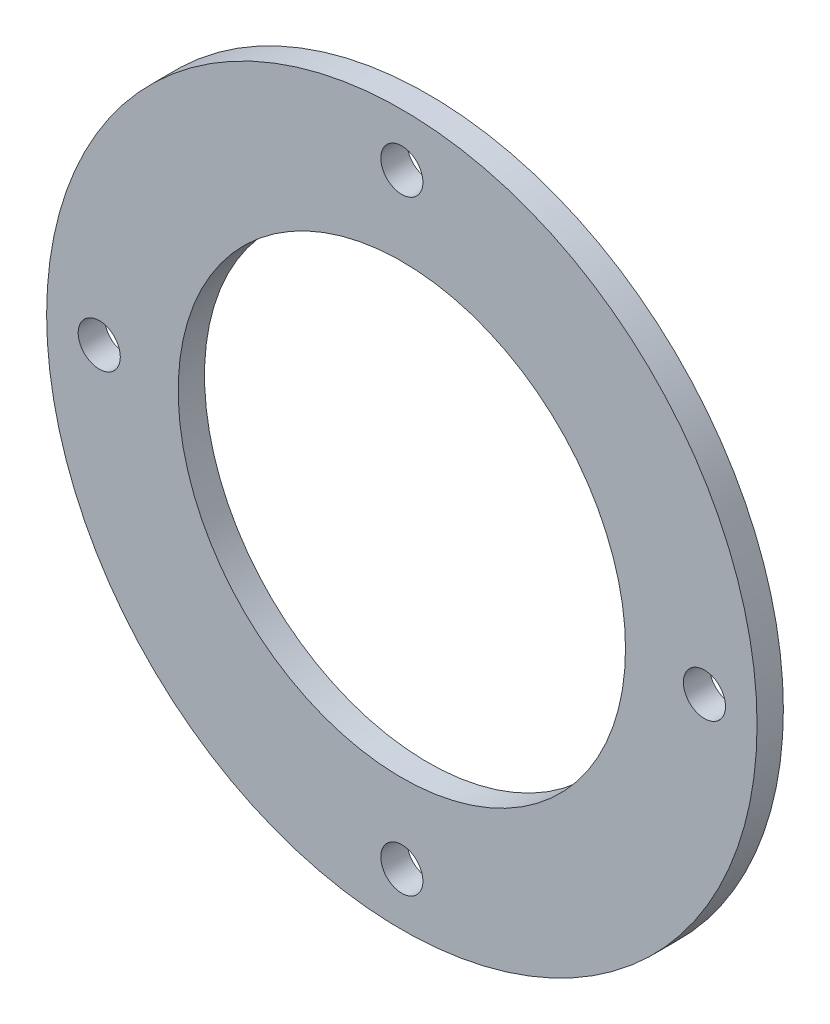
ISO-10303-21;
HEADER;
FILE_DESCRIPTION(('STEP AP214'),'2;1');
FILE_NAME('part.step','',(''),(''),'','','');
FILE_SCHEMA(('AUTOMOTIVE_DESIGN { 1 0 10303 214 1 1 1 1 }'));
ENDSEC;
DATA;
#1=APPLICATION_CONTEXT('core data for automotive mechanical design processes');
#2=APPLICATION_PROTOCOL_DEFINITION('international standard','automotive_design',2000,#1);
#3=PRODUCT_CONTEXT('',#1,'mechanical');
#4=PRODUCT('Part','Part','',(#3));
#5=PRODUCT_RELATED_PRODUCT_CATEGORY('part','',(#4));
#6=PRODUCT_DEFINITION_FORMATION('','',#4);
#7=PRODUCT_DEFINITION_CONTEXT('part definition',#1,'design');
#8=PRODUCT_DEFINITION('design','',#6,#7);
#9=PRODUCT_DEFINITION_SHAPE('','',#8);
#10=(LENGTH_UNIT() NAMED_UNIT(*) SI_UNIT(.MILLI.,.METRE.));
#11=(NAMED_UNIT(*) PLANE_ANGLE_UNIT() SI_UNIT($,.RADIAN.));
#12=(NAMED_UNIT(*) SI_UNIT($,.STERADIAN.) SOLID_ANGLE_UNIT());
#13=UNCERTAINTY_MEASURE_WITH_UNIT(LENGTH_MEASURE(1.E-05),#10,'distance_accuracy_value','');
#14=(GEOMETRIC_REPRESENTATION_CONTEXT(3) GLOBAL_UNCERTAINTY_ASSIGNED_CONTEXT((#13)) GLOBAL_UNIT_ASSIGNED_CONTEXT((#10,
#11,#12)) REPRESENTATION_CONTEXT('',''));
#15=CARTESIAN_POINT('',(0.,0.,0.));
#16=DIRECTION('',(0.,0.,1.));
#17=DIRECTION('',(1.,0.,0.));
#18=AXIS2_PLACEMENT_3D('',#15,#16,#17);
#19=CARTESIAN_POINT('',(0.,0.,2.));
#20=DIRECTION('',(0.,0.,1.));
#21=DIRECTION('',(1.,0.,0.));
#22=AXIS2_PLACEMENT_3D('',#19,#20,#21);
#23=PLANE('',#22);
#24=CARTESIAN_POINT('',(0.,-23.,2.));
#25=DIRECTION('',(0.,0.,1.));
#26=DIRECTION('',(1.,0.,0.));
#27=AXIS2_PLACEMENT_3D('',#24,#25,#26);
#28=CIRCLE('',#27,1.6);
#29=CARTESIAN_POINT('',(1.6,-23.,2.));
#30=VERTEX_POINT('',#29);
#31=EDGE_CURVE('E60',#30,#30,#28,.T.);
#32=ORIENTED_EDGE('',*,*,#31,.F.);
#33=EDGE_LOOP('',(#32));
#34=FACE_BOUND('',#33,.T.);
#35=CARTESIAN_POINT('',(0.,23.,2.));
#36=DIRECTION('',(0.,0.,1.));
#37=DIRECTION('',(1.,0.,0.));
#38=AXIS2_PLACEMENT_3D('',#35,#36,#37);
#39=CIRCLE('',#38,1.60000000000001);
#40=CARTESIAN_POINT('',(1.60000000000001,23.,2.));
#41=VERTEX_POINT('',#40);
#42=EDGE_CURVE('E48',#41,#41,#39,.T.);
#43=ORIENTED_EDGE('',*,*,#42,.F.);
#44=EDGE_LOOP('',(#43));
#45=FACE_BOUND('',#44,.T.);
#46=CARTESIAN_POINT('',(0.,0.,2.));
#47=DIRECTION('',(0.,0.,1.));
#48=DIRECTION('',(1.,0.,0.));
#49=AXIS2_PLACEMENT_3D('',#46,#47,#48);
#50=CIRCLE('',#49,27.);
#51=CARTESIAN_POINT('',(27.,0.,2.));
#52=VERTEX_POINT('',#51);
#53=EDGE_CURVE('E10',#52,#52,#50,.T.);
#54=ORIENTED_EDGE('',*,*,#53,.T.);
#55=EDGE_LOOP('',(#54));
#56=FACE_BOUND('',#55,.T.);
#57=CARTESIAN_POINT('',(0.,0.,2.));
#58=DIRECTION('',(0.,0.,1.));
#59=DIRECTION('',(1.,0.,0.));
#60=AXIS2_PLACEMENT_3D('',#57,#58,#59);
#61=CIRCLE('',#60,17.);
#62=CARTESIAN_POINT('',(17.,0.,2.));
#63=VERTEX_POINT('',#62);
#64=EDGE_CURVE('E43',#63,#63,#61,.T.);
#65=ORIENTED_EDGE('',*,*,#64,.F.);
#66=EDGE_LOOP('',(#65));
#67=FACE_BOUND('',#66,.T.);
#68=CARTESIAN_POINT('',(23.,0.,2.));
#69=DIRECTION('',(0.,0.,1.));
#70=DIRECTION('',(1.,0.,0.));
#71=AXIS2_PLACEMENT_3D('',#68,#69,#70);
#72=CIRCLE('',#71,1.60000000000008);
#73=CARTESIAN_POINT('',(24.6000000000001,0.,2.));
#74=VERTEX_POINT('',#73);
#75=EDGE_CURVE('E54',#74,#74,#72,.T.);
#76=ORIENTED_EDGE('',*,*,#75,.F.);
#77=EDGE_LOOP('',(#76));
#78=FACE_BOUND('',#77,.T.);
#79=CARTESIAN_POINT('',(-23.,0.,2.));
#80=DIRECTION('',(0.,0.,1.));
#81=DIRECTION('',(1.,0.,0.));
#82=AXIS2_PLACEMENT_3D('',#79,#80,#81);
#83=CIRCLE('',#82,1.6);
#84=CARTESIAN_POINT('',(-21.4,0.,2.));
#85=VERTEX_POINT('',#84);
#86=EDGE_CURVE('E66',#85,#85,#83,.T.);
#87=ORIENTED_EDGE('',*,*,#86,.F.);
#88=EDGE_LOOP('',(#87));
#89=FACE_BOUND('',#88,.T.);
#90=ADVANCED_FACE('F32',(#34,#45,#56,#67,#78,#89),#23,.T.);
#91=CARTESIAN_POINT('',(0.,0.,0.));
#92=DIRECTION('',(0.,0.,1.));
#93=DIRECTION('',(1.,0.,0.));
#94=AXIS2_PLACEMENT_3D('',#91,#92,#93);
#95=PLANE('',#94);
#96=CARTESIAN_POINT('',(0.,0.,0.));
#97=DIRECTION('',(0.,0.,1.));
#98=DIRECTION('',(1.,0.,0.));
#99=AXIS2_PLACEMENT_3D('',#96,#97,#98);
#100=CIRCLE('',#99,27.);
#101=CARTESIAN_POINT('',(27.,0.,0.));
#102=VERTEX_POINT('',#101);
#103=EDGE_CURVE('E36',#102,#102,#100,.T.);
#104=ORIENTED_EDGE('',*,*,#103,.F.);
#105=EDGE_LOOP('',(#104));
#106=FACE_BOUND('',#105,.T.);
#107=CARTESIAN_POINT('',(0.,0.,0.));
#108=DIRECTION('',(0.,0.,1.));
#109=DIRECTION('',(1.,0.,0.));
#110=AXIS2_PLACEMENT_3D('',#107,#108,#109);
#111=CIRCLE('',#110,17.);
#112=CARTESIAN_POINT('',(17.,0.,0.));
#113=VERTEX_POINT('',#112);
#114=EDGE_CURVE('E45',#113,#113,#111,.T.);
#115=ORIENTED_EDGE('',*,*,#114,.T.);
#116=EDGE_LOOP('',(#115));
#117=FACE_BOUND('',#116,.T.);
#118=CARTESIAN_POINT('',(0.,23.,0.));
#119=DIRECTION('',(0.,0.,1.));
#120=DIRECTION('',(1.,0.,0.));
#121=AXIS2_PLACEMENT_3D('',#118,#119,#120);
#122=CIRCLE('',#121,1.60000000000001);
#123=CARTESIAN_POINT('',(1.60000000000001,23.,0.));
#124=VERTEX_POINT('',#123);
#125=EDGE_CURVE('E51',#124,#124,#122,.T.);
#126=ORIENTED_EDGE('',*,*,#125,.T.);
#127=EDGE_LOOP('',(#126));
#128=FACE_BOUND('',#127,.T.);
#129=CARTESIAN_POINT('',(23.,0.,0.));
#130=DIRECTION('',(0.,0.,1.));
#131=DIRECTION('',(1.,0.,0.));
#132=AXIS2_PLACEMENT_3D('',#129,#130,#131);
#133=CIRCLE('',#132,1.60000000000008);
#134=CARTESIAN_POINT('',(24.6000000000001,0.,0.));
#135=VERTEX_POINT('',#134);
#136=EDGE_CURVE('E57',#135,#135,#133,.T.);
#137=ORIENTED_EDGE('',*,*,#136,.T.);
#138=EDGE_LOOP('',(#137));
#139=FACE_BOUND('',#138,.T.);
#140=CARTESIAN_POINT('',(0.,-23.,0.));
#141=DIRECTION('',(0.,0.,1.));
#142=DIRECTION('',(1.,0.,0.));
#143=AXIS2_PLACEMENT_3D('',#140,#141,#142);
#144=CIRCLE('',#143,1.6);
#145=CARTESIAN_POINT('',(1.6,-23.,0.));
#146=VERTEX_POINT('',#145);
#147=EDGE_CURVE('E63',#146,#146,#144,.T.);
#148=ORIENTED_EDGE('',*,*,#147,.T.);
#149=EDGE_LOOP('',(#148));
#150=FACE_BOUND('',#149,.T.);
#151=CARTESIAN_POINT('',(-23.,0.,0.));
#152=DIRECTION('',(0.,0.,1.));
#153=DIRECTION('',(1.,0.,0.));
#154=AXIS2_PLACEMENT_3D('',#151,#152,#153);
#155=CIRCLE('',#154,1.6);
#156=CARTESIAN_POINT('',(-21.4,0.,0.));
#157=VERTEX_POINT('',#156);
#158=EDGE_CURVE('E69',#157,#157,#155,.T.);
#159=ORIENTED_EDGE('',*,*,#158,.T.);
#160=EDGE_LOOP('',(#159));
#161=FACE_BOUND('',#160,.T.);
#162=ADVANCED_FACE('F79',(#106,#117,#128,#139,#150,#161),#95,.F.);
#163=CARTESIAN_POINT('',(0.,0.,2.));
#164=DIRECTION('',(0.,0.,-1.));
#165=DIRECTION('',(-1.,0.,0.));
#166=AXIS2_PLACEMENT_3D('',#163,#164,#165);
#167=CYLINDRICAL_SURFACE('',#166,27.);
#168=ORIENTED_EDGE('',*,*,#53,.F.);
#169=EDGE_LOOP('',(#168));
#170=FACE_BOUND('',#169,.T.);
#171=ORIENTED_EDGE('',*,*,#103,.T.);
#172=EDGE_LOOP('',(#171));
#173=FACE_BOUND('',#172,.T.);
#174=ADVANCED_FACE('F34',(#170,#173),#167,.T.);
#175=CARTESIAN_POINT('',(0.,0.,2.));
#176=DIRECTION('',(0.,0.,-1.));
#177=DIRECTION('',(-1.,0.,0.));
#178=AXIS2_PLACEMENT_3D('',#175,#176,#177);
#179=CYLINDRICAL_SURFACE('',#178,17.);
#180=ORIENTED_EDGE('',*,*,#64,.T.);
#181=EDGE_LOOP('',(#180));
#182=FACE_BOUND('',#181,.T.);
#183=ORIENTED_EDGE('',*,*,#114,.F.);
#184=EDGE_LOOP('',(#183));
#185=FACE_BOUND('',#184,.T.);
#186=ADVANCED_FACE('F89',(#182,#185),#179,.F.);
#187=CARTESIAN_POINT('',(0.,23.,2.));
#188=DIRECTION('',(0.,0.,-1.));
#189=DIRECTION('',(-1.,0.,0.));
#190=AXIS2_PLACEMENT_3D('',#187,#188,#189);
#191=CYLINDRICAL_SURFACE('',#190,1.60000000000001);
#192=ORIENTED_EDGE('',*,*,#42,.T.);
#193=EDGE_LOOP('',(#192));
#194=FACE_BOUND('',#193,.T.);
#195=ORIENTED_EDGE('',*,*,#125,.F.);
#196=EDGE_LOOP('',(#195));
#197=FACE_BOUND('',#196,.T.);
#198=ADVANCED_FACE('F92',(#194,#197),#191,.F.);
#199=CARTESIAN_POINT('',(23.,0.,2.));
#200=DIRECTION('',(0.,0.,-1.));
#201=DIRECTION('',(-1.,0.,0.));
#202=AXIS2_PLACEMENT_3D('',#199,#200,#201);
#203=CYLINDRICAL_SURFACE('',#202,1.60000000000008);
#204=ORIENTED_EDGE('',*,*,#75,.T.);
#205=EDGE_LOOP('',(#204));
#206=FACE_BOUND('',#205,.T.);
#207=ORIENTED_EDGE('',*,*,#136,.F.);
#208=EDGE_LOOP('',(#207));
#209=FACE_BOUND('',#208,.T.);
#210=ADVANCED_FACE('F96',(#206,#209),#203,.F.);
#211=CARTESIAN_POINT('',(0.,-23.,2.));
#212=DIRECTION('',(0.,0.,-1.));
#213=DIRECTION('',(-1.,0.,0.));
#214=AXIS2_PLACEMENT_3D('',#211,#212,#213);
#215=CYLINDRICAL_SURFACE('',#214,1.6);
#216=ORIENTED_EDGE('',*,*,#31,.T.);
#217=EDGE_LOOP('',(#216));
#218=FACE_BOUND('',#217,.T.);
#219=ORIENTED_EDGE('',*,*,#147,.F.);
#220=EDGE_LOOP('',(#219));
#221=FACE_BOUND('',#220,.T.);
#222=ADVANCED_FACE('F100',(#218,#221),#215,.F.);
#223=CARTESIAN_POINT('',(-23.,0.,2.));
#224=DIRECTION('',(0.,0.,-1.));
#225=DIRECTION('',(-1.,0.,0.));
#226=AXIS2_PLACEMENT_3D('',#223,#224,#225);
#227=CYLINDRICAL_SURFACE('',#226,1.6);
#228=ORIENTED_EDGE('',*,*,#86,.T.);
#229=EDGE_LOOP('',(#228));
#230=FACE_BOUND('',#229,.T.);
#231=ORIENTED_EDGE('',*,*,#158,.F.);
#232=EDGE_LOOP('',(#231));
#233=FACE_BOUND('',#232,.T.);
#234=ADVANCED_FACE('F75',(#230,#233),#227,.F.);
#235=CLOSED_SHELL('',(#90,#162,#174,#186,#198,#210,#222,#234));
#236=MANIFOLD_SOLID_BREP('B2',#235);
#237=ADVANCED_BREP_SHAPE_REPRESENTATION('',(#18,#236),#14);
#238=SHAPE_DEFINITION_REPRESENTATION(#9,#237);
ENDSEC;
END-ISO-10303-21;
